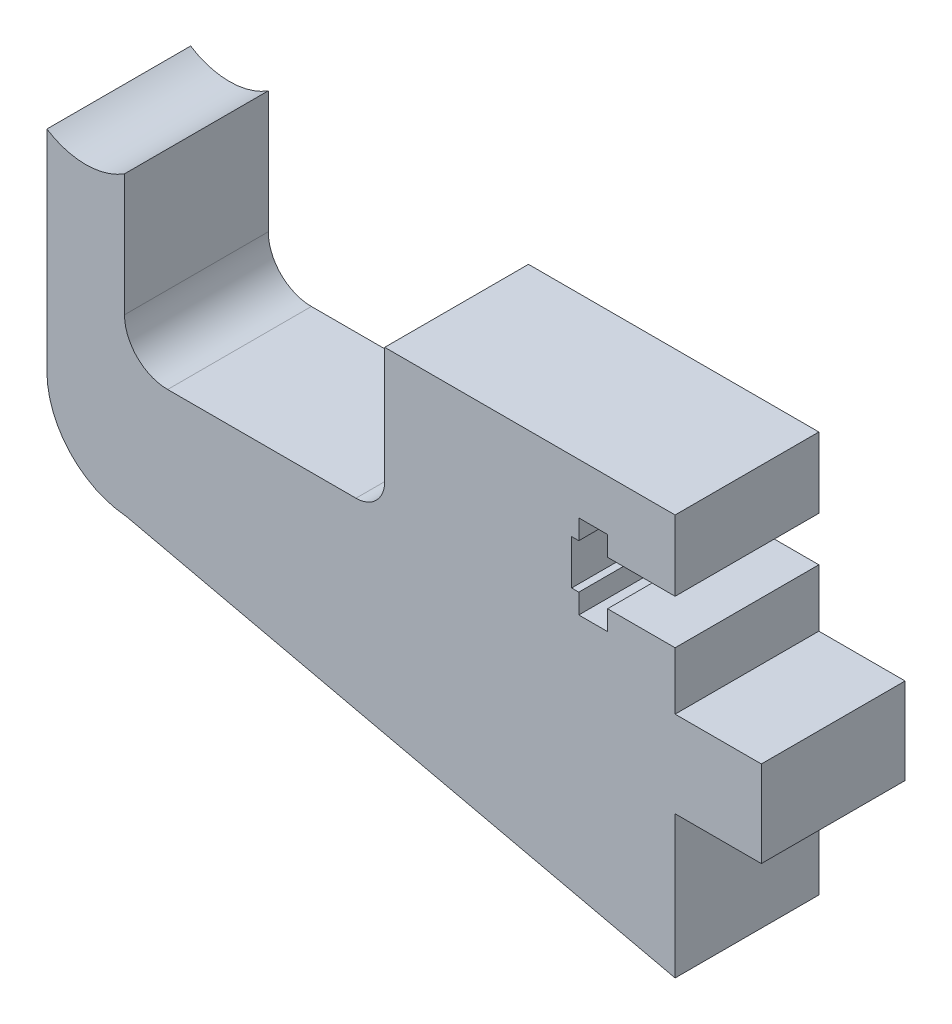
ISO-10303-21;
HEADER;
FILE_DESCRIPTION(('STEP AP214'),'2;1');
FILE_NAME('part.step','',(''),(''),'','','');
FILE_SCHEMA(('AUTOMOTIVE_DESIGN { 1 0 10303 214 1 1 1 1 }'));
ENDSEC;
DATA;
#1=APPLICATION_CONTEXT('core data for automotive mechanical design processes');
#2=APPLICATION_PROTOCOL_DEFINITION('international standard','automotive_design',2000,#1);
#3=PRODUCT_CONTEXT('',#1,'mechanical');
#4=PRODUCT('Part','Part','',(#3));
#5=PRODUCT_RELATED_PRODUCT_CATEGORY('part','',(#4));
#6=PRODUCT_DEFINITION_FORMATION('','',#4);
#7=PRODUCT_DEFINITION_CONTEXT('part definition',#1,'design');
#8=PRODUCT_DEFINITION('design','',#6,#7);
#9=PRODUCT_DEFINITION_SHAPE('','',#8);
#10=(LENGTH_UNIT() NAMED_UNIT(*) SI_UNIT(.MILLI.,.METRE.));
#11=(NAMED_UNIT(*) PLANE_ANGLE_UNIT() SI_UNIT($,.RADIAN.));
#12=(NAMED_UNIT(*) SI_UNIT($,.STERADIAN.) SOLID_ANGLE_UNIT());
#13=UNCERTAINTY_MEASURE_WITH_UNIT(LENGTH_MEASURE(1.E-05),#10,'distance_accuracy_value','');
#14=(GEOMETRIC_REPRESENTATION_CONTEXT(3) GLOBAL_UNCERTAINTY_ASSIGNED_CONTEXT((#13)) GLOBAL_UNIT_ASSIGNED_CONTEXT((#10,
#11,#12)) REPRESENTATION_CONTEXT('',''));
#15=CARTESIAN_POINT('',(0.,0.,0.));
#16=DIRECTION('',(0.,0.,1.));
#17=DIRECTION('',(1.,0.,0.));
#18=AXIS2_PLACEMENT_3D('',#15,#16,#17);
#19=CARTESIAN_POINT('',(-324.852783983054,-479.408833405451,10.));
#20=DIRECTION('',(0.,0.,-1.));
#21=DIRECTION('',(-1.,0.,0.));
#22=AXIS2_PLACEMENT_3D('',#19,#20,#21);
#23=CYLINDRICAL_SURFACE('',#22,3.);
#24=CARTESIAN_POINT('',(-324.852783983054,-479.408833405451,0.));
#25=DIRECTION('',(0.,0.,-1.));
#26=DIRECTION('',(-1.,0.,0.));
#27=AXIS2_PLACEMENT_3D('',#24,#25,#26);
#28=CIRCLE('',#27,3.);
#29=CARTESIAN_POINT('',(-324.852783983054,-482.408833405451,0.));
#30=VERTEX_POINT('',#29);
#31=CARTESIAN_POINT('',(-327.852783983054,-479.408833405451,0.));
#32=VERTEX_POINT('',#31);
#33=EDGE_CURVE('E245',#30,#32,#28,.T.);
#34=ORIENTED_EDGE('',*,*,#33,.T.);
#35=DIRECTION('',(0.,0.,-1.));
#36=VECTOR('',#35,1.);
#37=CARTESIAN_POINT('',(-327.852783983054,-479.408833405451,10.));
#38=LINE('',#37,#36);
#39=CARTESIAN_POINT('',(-327.852783983054,-479.408833405451,10.));
#40=VERTEX_POINT('',#39);
#41=EDGE_CURVE('E11',#40,#32,#38,.T.);
#42=ORIENTED_EDGE('',*,*,#41,.F.);
#43=CARTESIAN_POINT('',(-324.852783983054,-479.408833405451,10.));
#44=DIRECTION('',(0.,0.,-1.));
#45=DIRECTION('',(-1.,0.,0.));
#46=AXIS2_PLACEMENT_3D('',#43,#44,#45);
#47=CIRCLE('',#46,3.);
#48=CARTESIAN_POINT('',(-324.852783983054,-482.408833405451,10.));
#49=VERTEX_POINT('',#48);
#50=EDGE_CURVE('E300',#49,#40,#47,.T.);
#51=ORIENTED_EDGE('',*,*,#50,.F.);
#52=DIRECTION('',(0.,0.,-1.));
#53=VECTOR('',#52,1.);
#54=CARTESIAN_POINT('',(-324.852783983054,-482.408833405451,10.));
#55=LINE('',#54,#53);
#56=EDGE_CURVE('E241',#49,#30,#55,.T.);
#57=ORIENTED_EDGE('',*,*,#56,.T.);
#58=EDGE_LOOP('',(#34,#42,#51,#57));
#59=FACE_BOUND('',#58,.T.);
#60=ADVANCED_FACE('F34',(#59),#23,.F.);
#61=CARTESIAN_POINT('',(-327.852783983054,-473.308184899889,10.));
#62=DIRECTION('',(-1.,0.,0.));
#63=DIRECTION('',(0.,0.,1.));
#64=AXIS2_PLACEMENT_3D('',#61,#62,#63);
#65=PLANE('',#64);
#66=DIRECTION('',(0.,1.,0.));
#67=VECTOR('',#66,1.);
#68=CARTESIAN_POINT('',(-327.852783983054,-473.308184899889,0.));
#69=LINE('',#68,#67);
#70=CARTESIAN_POINT('',(-327.852783983054,-470.917158487951,0.));
#71=VERTEX_POINT('',#70);
#72=EDGE_CURVE('E248',#32,#71,#69,.T.);
#73=ORIENTED_EDGE('',*,*,#72,.T.);
#74=DIRECTION('',(0.,0.,-1.));
#75=VECTOR('',#74,1.);
#76=CARTESIAN_POINT('',(-327.852783983054,-470.917158487951,10.));
#77=LINE('',#76,#75);
#78=CARTESIAN_POINT('',(-327.852783983054,-470.917158487951,10.));
#79=VERTEX_POINT('',#78);
#80=EDGE_CURVE('E42',#79,#71,#77,.T.);
#81=ORIENTED_EDGE('',*,*,#80,.F.);
#82=DIRECTION('',(0.,1.,0.));
#83=VECTOR('',#82,1.);
#84=CARTESIAN_POINT('',(-327.852783983054,-478.408833405451,10.));
#85=LINE('',#84,#83);
#86=EDGE_CURVE('E148',#40,#79,#85,.T.);
#87=ORIENTED_EDGE('',*,*,#86,.F.);
#88=ORIENTED_EDGE('',*,*,#41,.T.);
#89=EDGE_LOOP('',(#73,#81,#87,#88));
#90=FACE_BOUND('',#89,.T.);
#91=ADVANCED_FACE('F442',(#90),#65,.F.);
#92=CARTESIAN_POINT('',(-330.552783983054,-466.708833405451,10.));
#93=DIRECTION('',(0.,0.,-1.));
#94=DIRECTION('',(-1.,0.,0.));
#95=AXIS2_PLACEMENT_3D('',#92,#93,#94);
#96=CYLINDRICAL_SURFACE('',#95,5.00000000000001);
#97=CARTESIAN_POINT('',(-330.552783983054,-466.708833405451,0.));
#98=DIRECTION('',(0.,0.,-1.));
#99=DIRECTION('',(-1.,0.,0.));
#100=AXIS2_PLACEMENT_3D('',#97,#98,#99);
#101=CIRCLE('',#100,5.00000000000001);
#102=CARTESIAN_POINT('',(-333.252783983054,-470.917158487951,0.));
#103=VERTEX_POINT('',#102);
#104=EDGE_CURVE('E250',#71,#103,#101,.T.);
#105=ORIENTED_EDGE('',*,*,#104,.T.);
#106=DIRECTION('',(0.,0.,-1.));
#107=VECTOR('',#106,1.);
#108=CARTESIAN_POINT('',(-333.252783983054,-470.917158487951,10.));
#109=LINE('',#108,#107);
#110=CARTESIAN_POINT('',(-333.252783983054,-470.917158487951,10.));
#111=VERTEX_POINT('',#110);
#112=EDGE_CURVE('E364',#111,#103,#109,.T.);
#113=ORIENTED_EDGE('',*,*,#112,.F.);
#114=CARTESIAN_POINT('',(-330.552783983054,-466.708833405451,10.));
#115=DIRECTION('',(0.,0.,-1.));
#116=DIRECTION('',(-1.,0.,0.));
#117=AXIS2_PLACEMENT_3D('',#114,#115,#116);
#118=CIRCLE('',#117,5.00000000000001);
#119=EDGE_CURVE('E372',#79,#111,#118,.T.);
#120=ORIENTED_EDGE('',*,*,#119,.F.);
#121=ORIENTED_EDGE('',*,*,#80,.T.);
#122=EDGE_LOOP('',(#105,#113,#120,#121));
#123=FACE_BOUND('',#122,.T.);
#124=ADVANCED_FACE('F370',(#123),#96,.F.);
#125=CARTESIAN_POINT('',(-333.252783983054,-470.917158487951,10.));
#126=DIRECTION('',(1.,0.,0.));
#127=DIRECTION('',(0.,0.,-1.));
#128=AXIS2_PLACEMENT_3D('',#125,#126,#127);
#129=PLANE('',#128);
#130=DIRECTION('',(0.,-1.,0.));
#131=VECTOR('',#130,1.);
#132=CARTESIAN_POINT('',(-333.252783983054,-470.917158487951,0.));
#133=LINE('',#132,#131);
#134=CARTESIAN_POINT('',(-333.252783983054,-485.514932983878,0.));
#135=VERTEX_POINT('',#134);
#136=EDGE_CURVE('E252',#103,#135,#133,.T.);
#137=ORIENTED_EDGE('',*,*,#136,.T.);
#138=DIRECTION('',(0.,0.,-1.));
#139=VECTOR('',#138,1.);
#140=CARTESIAN_POINT('',(-333.252783983054,-485.514932983878,10.));
#141=LINE('',#140,#139);
#142=CARTESIAN_POINT('',(-333.252783983054,-485.514932983878,10.));
#143=VERTEX_POINT('',#142);
#144=EDGE_CURVE('E361',#143,#135,#141,.T.);
#145=ORIENTED_EDGE('',*,*,#144,.F.);
#146=DIRECTION('',(0.,-1.,0.));
#147=VECTOR('',#146,1.);
#148=CARTESIAN_POINT('',(-333.252783983054,-470.917158487951,10.));
#149=LINE('',#148,#147);
#150=EDGE_CURVE('E388',#111,#143,#149,.T.);
#151=ORIENTED_EDGE('',*,*,#150,.F.);
#152=ORIENTED_EDGE('',*,*,#112,.T.);
#153=EDGE_LOOP('',(#137,#145,#151,#152));
#154=FACE_BOUND('',#153,.T.);
#155=ADVANCED_FACE('F379',(#154),#129,.F.);
#156=CARTESIAN_POINT('',(-327.252783983054,-485.514932983878,10.));
#157=DIRECTION('',(0.,0.,-1.));
#158=DIRECTION('',(-1.,0.,0.));
#159=AXIS2_PLACEMENT_3D('',#156,#157,#158);
#160=CYLINDRICAL_SURFACE('',#159,6.00000000000001);
#161=CARTESIAN_POINT('',(-327.252783983054,-485.514932983878,0.));
#162=DIRECTION('',(0.,0.,1.));
#163=DIRECTION('',(-1.,0.,0.));
#164=AXIS2_PLACEMENT_3D('',#161,#162,#163);
#165=CIRCLE('',#164,6.00000000000001);
#166=CARTESIAN_POINT('',(-327.723397776628,-491.496448064299,0.));
#167=VERTEX_POINT('',#166);
#168=EDGE_CURVE('E254',#135,#167,#165,.T.);
#169=ORIENTED_EDGE('',*,*,#168,.T.);
#170=DIRECTION('',(0.,0.,-1.));
#171=VECTOR('',#170,1.);
#172=CARTESIAN_POINT('',(-327.723397776628,-491.496448064299,10.));
#173=LINE('',#172,#171);
#174=CARTESIAN_POINT('',(-327.723397776628,-491.496448064299,10.));
#175=VERTEX_POINT('',#174);
#176=EDGE_CURVE('E358',#175,#167,#173,.T.);
#177=ORIENTED_EDGE('',*,*,#176,.F.);
#178=CARTESIAN_POINT('',(-327.252783983054,-485.514932983878,10.));
#179=DIRECTION('',(0.,0.,1.));
#180=DIRECTION('',(-1.,0.,0.));
#181=AXIS2_PLACEMENT_3D('',#178,#179,#180);
#182=CIRCLE('',#181,6.00000000000001);
#183=EDGE_CURVE('E385',#143,#175,#182,.T.);
#184=ORIENTED_EDGE('',*,*,#183,.F.);
#185=ORIENTED_EDGE('',*,*,#144,.T.);
#186=EDGE_LOOP('',(#169,#177,#184,#185));
#187=FACE_BOUND('',#186,.T.);
#188=ADVANCED_FACE('F383',(#187),#160,.T.);
#189=CARTESIAN_POINT('',(-289.552783983054,-500.213295040318,10.));
#190=DIRECTION('',(0.222633899894127,0.974902121557817,0.));
#191=DIRECTION('',(-0.974902121557817,0.222633899894127,0.));
#192=AXIS2_PLACEMENT_3D('',#189,#190,#191);
#193=PLANE('',#192);
#194=DIRECTION('',(0.974902121557817,-0.222633899894127,0.));
#195=VECTOR('',#194,1.);
#196=CARTESIAN_POINT('',(-289.552783983054,-500.213295040318,0.));
#197=LINE('',#196,#195);
#198=CARTESIAN_POINT('',(-289.552783983054,-500.213295040318,0.));
#199=VERTEX_POINT('',#198);
#200=EDGE_CURVE('E256',#167,#199,#197,.T.);
#201=ORIENTED_EDGE('',*,*,#200,.T.);
#202=DIRECTION('',(0.,0.,-1.));
#203=VECTOR('',#202,1.);
#204=CARTESIAN_POINT('',(-289.552783983054,-500.213295040318,10.));
#205=LINE('',#204,#203);
#206=CARTESIAN_POINT('',(-289.552783983054,-500.213295040318,10.));
#207=VERTEX_POINT('',#206);
#208=EDGE_CURVE('E355',#207,#199,#205,.T.);
#209=ORIENTED_EDGE('',*,*,#208,.F.);
#210=DIRECTION('',(0.974902121557817,-0.222633899894127,0.));
#211=VECTOR('',#210,1.);
#212=CARTESIAN_POINT('',(-289.552783983054,-500.213295040318,10.));
#213=LINE('',#212,#211);
#214=EDGE_CURVE('E387',#175,#207,#213,.T.);
#215=ORIENTED_EDGE('',*,*,#214,.F.);
#216=ORIENTED_EDGE('',*,*,#176,.T.);
#217=EDGE_LOOP('',(#201,#209,#215,#216));
#218=FACE_BOUND('',#217,.T.);
#219=ADVANCED_FACE('F454',(#218),#193,.F.);
#220=CARTESIAN_POINT('',(-289.552783983054,-490.318864182122,10.));
#221=DIRECTION('',(-1.,0.,0.));
#222=DIRECTION('',(0.,0.,1.));
#223=AXIS2_PLACEMENT_3D('',#220,#221,#222);
#224=PLANE('',#223);
#225=DIRECTION('',(0.,1.,0.));
#226=VECTOR('',#225,1.);
#227=CARTESIAN_POINT('',(-289.552783983054,-490.318864182122,0.));
#228=LINE('',#227,#226);
#229=CARTESIAN_POINT('',(-289.552783983054,-490.318864182122,0.));
#230=VERTEX_POINT('',#229);
#231=EDGE_CURVE('E259',#199,#230,#228,.T.);
#232=ORIENTED_EDGE('',*,*,#231,.T.);
#233=DIRECTION('',(0.,0.,-1.));
#234=VECTOR('',#233,1.);
#235=CARTESIAN_POINT('',(-289.552783983054,-490.318864182122,10.));
#236=LINE('',#235,#234);
#237=CARTESIAN_POINT('',(-289.552783983054,-490.318864182122,10.));
#238=VERTEX_POINT('',#237);
#239=EDGE_CURVE('E352',#238,#230,#236,.T.);
#240=ORIENTED_EDGE('',*,*,#239,.F.);
#241=DIRECTION('',(0.,1.,0.));
#242=VECTOR('',#241,1.);
#243=CARTESIAN_POINT('',(-289.552783983054,-494.315935468564,10.));
#244=LINE('',#243,#242);
#245=EDGE_CURVE('E390',#207,#238,#244,.T.);
#246=ORIENTED_EDGE('',*,*,#245,.F.);
#247=ORIENTED_EDGE('',*,*,#208,.T.);
#248=EDGE_LOOP('',(#232,#240,#246,#247));
#249=FACE_BOUND('',#248,.T.);
#250=ADVANCED_FACE('F457',(#249),#224,.F.);
#251=CARTESIAN_POINT('',(-283.552783983054,-490.318864182122,10.));
#252=DIRECTION('',(0.,1.,0.));
#253=DIRECTION('',(0.,0.,1.));
#254=AXIS2_PLACEMENT_3D('',#251,#252,#253);
#255=PLANE('',#254);
#256=DIRECTION('',(1.,0.,0.));
#257=VECTOR('',#256,1.);
#258=CARTESIAN_POINT('',(-283.552783983054,-490.318864182122,0.));
#259=LINE('',#258,#257);
#260=CARTESIAN_POINT('',(-283.552783983054,-490.318864182122,0.));
#261=VERTEX_POINT('',#260);
#262=EDGE_CURVE('E261',#230,#261,#259,.T.);
#263=ORIENTED_EDGE('',*,*,#262,.T.);
#264=DIRECTION('',(0.,0.,-1.));
#265=VECTOR('',#264,1.);
#266=CARTESIAN_POINT('',(-283.552783983054,-490.318864182122,10.));
#267=LINE('',#266,#265);
#268=CARTESIAN_POINT('',(-283.552783983054,-490.318864182122,10.));
#269=VERTEX_POINT('',#268);
#270=EDGE_CURVE('E349',#269,#261,#267,.T.);
#271=ORIENTED_EDGE('',*,*,#270,.F.);
#272=DIRECTION('',(1.,0.,0.));
#273=VECTOR('',#272,1.);
#274=CARTESIAN_POINT('',(-283.552783983054,-490.318864182122,10.));
#275=LINE('',#274,#273);
#276=EDGE_CURVE('E396',#238,#269,#275,.T.);
#277=ORIENTED_EDGE('',*,*,#276,.F.);
#278=ORIENTED_EDGE('',*,*,#239,.T.);
#279=EDGE_LOOP('',(#263,#271,#277,#278));
#280=FACE_BOUND('',#279,.T.);
#281=ADVANCED_FACE('F461',(#280),#255,.F.);
#282=CARTESIAN_POINT('',(-283.552783983054,-484.318864182122,10.));
#283=DIRECTION('',(-1.,0.,0.));
#284=DIRECTION('',(0.,0.,1.));
#285=AXIS2_PLACEMENT_3D('',#282,#283,#284);
#286=PLANE('',#285);
#287=DIRECTION('',(0.,1.,0.));
#288=VECTOR('',#287,1.);
#289=CARTESIAN_POINT('',(-283.552783983054,-484.318864182122,0.));
#290=LINE('',#289,#288);
#291=CARTESIAN_POINT('',(-283.552783983054,-484.318864182122,0.));
#292=VERTEX_POINT('',#291);
#293=EDGE_CURVE('E263',#261,#292,#290,.T.);
#294=ORIENTED_EDGE('',*,*,#293,.T.);
#295=DIRECTION('',(0.,0.,-1.));
#296=VECTOR('',#295,1.);
#297=CARTESIAN_POINT('',(-283.552783983054,-484.318864182122,10.));
#298=LINE('',#297,#296);
#299=CARTESIAN_POINT('',(-283.552783983054,-484.318864182122,10.));
#300=VERTEX_POINT('',#299);
#301=EDGE_CURVE('E346',#300,#292,#298,.T.);
#302=ORIENTED_EDGE('',*,*,#301,.F.);
#303=DIRECTION('',(0.,1.,0.));
#304=VECTOR('',#303,1.);
#305=CARTESIAN_POINT('',(-283.552783983054,-484.318864182122,10.));
#306=LINE('',#305,#304);
#307=EDGE_CURVE('E398',#269,#300,#306,.T.);
#308=ORIENTED_EDGE('',*,*,#307,.F.);
#309=ORIENTED_EDGE('',*,*,#270,.T.);
#310=EDGE_LOOP('',(#294,#302,#308,#309));
#311=FACE_BOUND('',#310,.T.);
#312=ADVANCED_FACE('F465',(#311),#286,.F.);
#313=CARTESIAN_POINT('',(-289.552783983054,-484.318864182122,10.));
#314=DIRECTION('',(0.,-1.,0.));
#315=DIRECTION('',(0.,0.,-1.));
#316=AXIS2_PLACEMENT_3D('',#313,#314,#315);
#317=PLANE('',#316);
#318=DIRECTION('',(-1.,0.,0.));
#319=VECTOR('',#318,1.);
#320=CARTESIAN_POINT('',(-289.552783983054,-484.318864182122,0.));
#321=LINE('',#320,#319);
#322=CARTESIAN_POINT('',(-289.552783983054,-484.318864182122,0.));
#323=VERTEX_POINT('',#322);
#324=EDGE_CURVE('E265',#292,#323,#321,.T.);
#325=ORIENTED_EDGE('',*,*,#324,.T.);
#326=DIRECTION('',(0.,0.,-1.));
#327=VECTOR('',#326,1.);
#328=CARTESIAN_POINT('',(-289.552783983054,-484.318864182122,10.));
#329=LINE('',#328,#327);
#330=CARTESIAN_POINT('',(-289.552783983054,-484.318864182122,10.));
#331=VERTEX_POINT('',#330);
#332=EDGE_CURVE('E343',#331,#323,#329,.T.);
#333=ORIENTED_EDGE('',*,*,#332,.F.);
#334=DIRECTION('',(-1.,0.,0.));
#335=VECTOR('',#334,1.);
#336=CARTESIAN_POINT('',(-289.552783983054,-484.318864182122,10.));
#337=LINE('',#336,#335);
#338=EDGE_CURVE('E400',#300,#331,#337,.T.);
#339=ORIENTED_EDGE('',*,*,#338,.F.);
#340=ORIENTED_EDGE('',*,*,#301,.T.);
#341=EDGE_LOOP('',(#325,#333,#339,#340));
#342=FACE_BOUND('',#341,.T.);
#343=ADVANCED_FACE('F469',(#342),#317,.F.);
#344=CARTESIAN_POINT('',(-289.552783983054,-480.318864182122,10.));
#345=DIRECTION('',(-1.,0.,0.));
#346=DIRECTION('',(0.,-1.,0.));
#347=AXIS2_PLACEMENT_3D('',#344,#345,#346);
#348=PLANE('',#347);
#349=DIRECTION('',(0.,1.,0.));
#350=VECTOR('',#349,1.);
#351=CARTESIAN_POINT('',(-289.552783983054,-480.318864182122,0.));
#352=LINE('',#351,#350);
#353=CARTESIAN_POINT('',(-289.552783983054,-480.318864182122,0.));
#354=VERTEX_POINT('',#353);
#355=EDGE_CURVE('E267',#323,#354,#352,.T.);
#356=ORIENTED_EDGE('',*,*,#355,.T.);
#357=DIRECTION('',(0.,0.,-1.));
#358=VECTOR('',#357,1.);
#359=CARTESIAN_POINT('',(-289.552783983054,-480.318864182122,10.));
#360=LINE('',#359,#358);
#361=CARTESIAN_POINT('',(-289.552783983054,-480.318864182122,10.));
#362=VERTEX_POINT('',#361);
#363=EDGE_CURVE('E340',#362,#354,#360,.T.);
#364=ORIENTED_EDGE('',*,*,#363,.F.);
#365=DIRECTION('',(0.,1.,0.));
#366=VECTOR('',#365,1.);
#367=CARTESIAN_POINT('',(-289.552783983054,-480.318864182122,10.));
#368=LINE('',#367,#366);
#369=EDGE_CURVE('E402',#331,#362,#368,.T.);
#370=ORIENTED_EDGE('',*,*,#369,.F.);
#371=ORIENTED_EDGE('',*,*,#332,.T.);
#372=EDGE_LOOP('',(#356,#364,#370,#371));
#373=FACE_BOUND('',#372,.T.);
#374=ADVANCED_FACE('F473',(#373),#348,.F.);
#375=CARTESIAN_POINT('',(-294.252783983054,-480.318864182122,10.));
#376=DIRECTION('',(0.,-1.,0.));
#377=DIRECTION('',(0.,0.,-1.));
#378=AXIS2_PLACEMENT_3D('',#375,#376,#377);
#379=PLANE('',#378);
#380=DIRECTION('',(-1.,0.,0.));
#381=VECTOR('',#380,1.);
#382=CARTESIAN_POINT('',(-294.252783983054,-480.318864182122,0.));
#383=LINE('',#382,#381);
#384=CARTESIAN_POINT('',(-294.252783983054,-480.318864182122,0.));
#385=VERTEX_POINT('',#384);
#386=EDGE_CURVE('E269',#354,#385,#383,.T.);
#387=ORIENTED_EDGE('',*,*,#386,.T.);
#388=DIRECTION('',(0.,0.,-1.));
#389=VECTOR('',#388,1.);
#390=CARTESIAN_POINT('',(-294.252783983054,-480.318864182122,10.));
#391=LINE('',#390,#389);
#392=CARTESIAN_POINT('',(-294.252783983054,-480.318864182122,10.));
#393=VERTEX_POINT('',#392);
#394=EDGE_CURVE('E337',#393,#385,#391,.T.);
#395=ORIENTED_EDGE('',*,*,#394,.F.);
#396=DIRECTION('',(-1.,0.,0.));
#397=VECTOR('',#396,1.);
#398=CARTESIAN_POINT('',(-294.252783983054,-480.318864182122,10.));
#399=LINE('',#398,#397);
#400=EDGE_CURVE('E404',#362,#393,#399,.T.);
#401=ORIENTED_EDGE('',*,*,#400,.F.);
#402=ORIENTED_EDGE('',*,*,#363,.T.);
#403=EDGE_LOOP('',(#387,#395,#401,#402));
#404=FACE_BOUND('',#403,.T.);
#405=ADVANCED_FACE('F477',(#404),#379,.F.);
#406=CARTESIAN_POINT('',(-294.252783983054,-480.318864182122,10.));
#407=DIRECTION('',(1.,0.,0.));
#408=DIRECTION('',(0.,0.,-1.));
#409=AXIS2_PLACEMENT_3D('',#406,#407,#408);
#410=PLANE('',#409);
#411=DIRECTION('',(0.,-1.,0.));
#412=VECTOR('',#411,1.);
#413=CARTESIAN_POINT('',(-294.252783983054,-480.318864182122,0.));
#414=LINE('',#413,#412);
#415=CARTESIAN_POINT('',(-294.252783983054,-481.693864182122,0.));
#416=VERTEX_POINT('',#415);
#417=EDGE_CURVE('E271',#385,#416,#414,.T.);
#418=ORIENTED_EDGE('',*,*,#417,.T.);
#419=DIRECTION('',(0.,0.,-1.));
#420=VECTOR('',#419,1.);
#421=CARTESIAN_POINT('',(-294.252783983054,-481.693864182122,10.));
#422=LINE('',#421,#420);
#423=CARTESIAN_POINT('',(-294.252783983054,-481.693864182122,10.));
#424=VERTEX_POINT('',#423);
#425=EDGE_CURVE('E334',#424,#416,#422,.T.);
#426=ORIENTED_EDGE('',*,*,#425,.F.);
#427=DIRECTION('',(0.,-1.,0.));
#428=VECTOR('',#427,1.);
#429=CARTESIAN_POINT('',(-294.252783983054,-480.318864182122,10.));
#430=LINE('',#429,#428);
#431=EDGE_CURVE('E406',#393,#424,#430,.T.);
#432=ORIENTED_EDGE('',*,*,#431,.F.);
#433=ORIENTED_EDGE('',*,*,#394,.T.);
#434=EDGE_LOOP('',(#418,#426,#432,#433));
#435=FACE_BOUND('',#434,.T.);
#436=ADVANCED_FACE('F481',(#435),#410,.F.);
#437=CARTESIAN_POINT('',(-296.252783983054,-481.693864182122,10.));
#438=DIRECTION('',(0.,-1.,0.));
#439=DIRECTION('',(0.,0.,-1.));
#440=AXIS2_PLACEMENT_3D('',#437,#438,#439);
#441=PLANE('',#440);
#442=DIRECTION('',(-1.,0.,0.));
#443=VECTOR('',#442,1.);
#444=CARTESIAN_POINT('',(-296.252783983054,-481.693864182122,0.));
#445=LINE('',#444,#443);
#446=CARTESIAN_POINT('',(-296.252783983054,-481.693864182122,0.));
#447=VERTEX_POINT('',#446);
#448=EDGE_CURVE('E273',#416,#447,#445,.T.);
#449=ORIENTED_EDGE('',*,*,#448,.T.);
#450=DIRECTION('',(0.,0.,-1.));
#451=VECTOR('',#450,1.);
#452=CARTESIAN_POINT('',(-296.252783983054,-481.693864182122,10.));
#453=LINE('',#452,#451);
#454=CARTESIAN_POINT('',(-296.252783983054,-481.693864182122,10.));
#455=VERTEX_POINT('',#454);
#456=EDGE_CURVE('E331',#455,#447,#453,.T.);
#457=ORIENTED_EDGE('',*,*,#456,.F.);
#458=DIRECTION('',(-1.,0.,0.));
#459=VECTOR('',#458,1.);
#460=CARTESIAN_POINT('',(-296.252783983054,-481.693864182122,10.));
#461=LINE('',#460,#459);
#462=EDGE_CURVE('E408',#424,#455,#461,.T.);
#463=ORIENTED_EDGE('',*,*,#462,.F.);
#464=ORIENTED_EDGE('',*,*,#425,.T.);
#465=EDGE_LOOP('',(#449,#457,#463,#464));
#466=FACE_BOUND('',#465,.T.);
#467=ADVANCED_FACE('F485',(#466),#441,.F.);
#468=CARTESIAN_POINT('',(-296.252783983054,-480.318864182122,10.));
#469=DIRECTION('',(-1.,0.,0.));
#470=DIRECTION('',(0.,0.,1.));
#471=AXIS2_PLACEMENT_3D('',#468,#469,#470);
#472=PLANE('',#471);
#473=DIRECTION('',(0.,1.,0.));
#474=VECTOR('',#473,1.);
#475=CARTESIAN_POINT('',(-296.252783983054,-480.318864182122,0.));
#476=LINE('',#475,#474);
#477=CARTESIAN_POINT('',(-296.252783983054,-480.318864182122,0.));
#478=VERTEX_POINT('',#477);
#479=EDGE_CURVE('E275',#447,#478,#476,.T.);
#480=ORIENTED_EDGE('',*,*,#479,.T.);
#481=DIRECTION('',(0.,0.,-1.));
#482=VECTOR('',#481,1.);
#483=CARTESIAN_POINT('',(-296.252783983054,-480.318864182122,10.));
#484=LINE('',#483,#482);
#485=CARTESIAN_POINT('',(-296.252783983054,-480.318864182122,10.));
#486=VERTEX_POINT('',#485);
#487=EDGE_CURVE('E328',#486,#478,#484,.T.);
#488=ORIENTED_EDGE('',*,*,#487,.F.);
#489=DIRECTION('',(0.,1.,0.));
#490=VECTOR('',#489,1.);
#491=CARTESIAN_POINT('',(-296.252783983054,-480.318864182122,10.));
#492=LINE('',#491,#490);
#493=EDGE_CURVE('E410',#455,#486,#492,.T.);
#494=ORIENTED_EDGE('',*,*,#493,.F.);
#495=ORIENTED_EDGE('',*,*,#456,.T.);
#496=EDGE_LOOP('',(#480,#488,#494,#495));
#497=FACE_BOUND('',#496,.T.);
#498=ADVANCED_FACE('F489',(#497),#472,.F.);
#499=CARTESIAN_POINT('',(-296.252783983054,-480.318864182122,10.));
#500=DIRECTION('',(0.,-1.,0.));
#501=DIRECTION('',(0.,0.,-1.));
#502=AXIS2_PLACEMENT_3D('',#499,#500,#501);
#503=PLANE('',#502);
#504=DIRECTION('',(-1.,0.,0.));
#505=VECTOR('',#504,1.);
#506=CARTESIAN_POINT('',(-296.252783983054,-480.318864182122,0.));
#507=LINE('',#506,#505);
#508=CARTESIAN_POINT('',(-296.752783983054,-480.318864182122,0.));
#509=VERTEX_POINT('',#508);
#510=EDGE_CURVE('E277',#478,#509,#507,.T.);
#511=ORIENTED_EDGE('',*,*,#510,.T.);
#512=DIRECTION('',(0.,0.,-1.));
#513=VECTOR('',#512,1.);
#514=CARTESIAN_POINT('',(-296.752783983054,-480.318864182122,10.));
#515=LINE('',#514,#513);
#516=CARTESIAN_POINT('',(-296.752783983054,-480.318864182122,10.));
#517=VERTEX_POINT('',#516);
#518=EDGE_CURVE('E325',#517,#509,#515,.T.);
#519=ORIENTED_EDGE('',*,*,#518,.F.);
#520=DIRECTION('',(-1.,0.,0.));
#521=VECTOR('',#520,1.);
#522=CARTESIAN_POINT('',(-296.252783983054,-480.318864182122,10.));
#523=LINE('',#522,#521);
#524=EDGE_CURVE('E412',#486,#517,#523,.T.);
#525=ORIENTED_EDGE('',*,*,#524,.F.);
#526=ORIENTED_EDGE('',*,*,#487,.T.);
#527=EDGE_LOOP('',(#511,#519,#525,#526));
#528=FACE_BOUND('',#527,.T.);
#529=ADVANCED_FACE('F493',(#528),#503,.F.);
#530=CARTESIAN_POINT('',(-296.752783983054,-477.218864182122,10.));
#531=DIRECTION('',(-1.,0.,0.));
#532=DIRECTION('',(0.,0.,1.));
#533=AXIS2_PLACEMENT_3D('',#530,#531,#532);
#534=PLANE('',#533);
#535=DIRECTION('',(0.,1.,0.));
#536=VECTOR('',#535,1.);
#537=CARTESIAN_POINT('',(-296.752783983054,-477.218864182122,0.));
#538=LINE('',#537,#536);
#539=CARTESIAN_POINT('',(-296.752783983054,-477.218864182122,0.));
#540=VERTEX_POINT('',#539);
#541=EDGE_CURVE('E279',#509,#540,#538,.T.);
#542=ORIENTED_EDGE('',*,*,#541,.T.);
#543=DIRECTION('',(0.,0.,-1.));
#544=VECTOR('',#543,1.);
#545=CARTESIAN_POINT('',(-296.752783983054,-477.218864182122,10.));
#546=LINE('',#545,#544);
#547=CARTESIAN_POINT('',(-296.752783983054,-477.218864182122,10.));
#548=VERTEX_POINT('',#547);
#549=EDGE_CURVE('E322',#548,#540,#546,.T.);
#550=ORIENTED_EDGE('',*,*,#549,.F.);
#551=DIRECTION('',(0.,1.,0.));
#552=VECTOR('',#551,1.);
#553=CARTESIAN_POINT('',(-296.752783983054,-477.218864182122,10.));
#554=LINE('',#553,#552);
#555=EDGE_CURVE('E414',#517,#548,#554,.T.);
#556=ORIENTED_EDGE('',*,*,#555,.F.);
#557=ORIENTED_EDGE('',*,*,#518,.T.);
#558=EDGE_LOOP('',(#542,#550,#556,#557));
#559=FACE_BOUND('',#558,.T.);
#560=ADVANCED_FACE('F497',(#559),#534,.F.);
#561=CARTESIAN_POINT('',(-296.252783983054,-477.218864182122,10.));
#562=DIRECTION('',(0.,1.,0.));
#563=DIRECTION('',(0.,0.,1.));
#564=AXIS2_PLACEMENT_3D('',#561,#562,#563);
#565=PLANE('',#564);
#566=DIRECTION('',(1.,0.,0.));
#567=VECTOR('',#566,1.);
#568=CARTESIAN_POINT('',(-296.252783983054,-477.218864182122,0.));
#569=LINE('',#568,#567);
#570=CARTESIAN_POINT('',(-296.252783983054,-477.218864182122,0.));
#571=VERTEX_POINT('',#570);
#572=EDGE_CURVE('E281',#540,#571,#569,.T.);
#573=ORIENTED_EDGE('',*,*,#572,.T.);
#574=DIRECTION('',(0.,0.,-1.));
#575=VECTOR('',#574,1.);
#576=CARTESIAN_POINT('',(-296.252783983054,-477.218864182122,10.));
#577=LINE('',#576,#575);
#578=CARTESIAN_POINT('',(-296.252783983054,-477.218864182122,10.));
#579=VERTEX_POINT('',#578);
#580=EDGE_CURVE('E319',#579,#571,#577,.T.);
#581=ORIENTED_EDGE('',*,*,#580,.F.);
#582=DIRECTION('',(1.,0.,0.));
#583=VECTOR('',#582,1.);
#584=CARTESIAN_POINT('',(-296.252783983054,-477.218864182122,10.));
#585=LINE('',#584,#583);
#586=EDGE_CURVE('E416',#548,#579,#585,.T.);
#587=ORIENTED_EDGE('',*,*,#586,.F.);
#588=ORIENTED_EDGE('',*,*,#549,.T.);
#589=EDGE_LOOP('',(#573,#581,#587,#588));
#590=FACE_BOUND('',#589,.T.);
#591=ADVANCED_FACE('F501',(#590),#565,.F.);
#592=CARTESIAN_POINT('',(-296.252783983054,-475.843864182122,10.));
#593=DIRECTION('',(-1.,0.,0.));
#594=DIRECTION('',(0.,0.,1.));
#595=AXIS2_PLACEMENT_3D('',#592,#593,#594);
#596=PLANE('',#595);
#597=DIRECTION('',(0.,1.,0.));
#598=VECTOR('',#597,1.);
#599=CARTESIAN_POINT('',(-296.252783983054,-475.843864182122,0.));
#600=LINE('',#599,#598);
#601=CARTESIAN_POINT('',(-296.252783983054,-475.843864182122,0.));
#602=VERTEX_POINT('',#601);
#603=EDGE_CURVE('E283',#571,#602,#600,.T.);
#604=ORIENTED_EDGE('',*,*,#603,.T.);
#605=DIRECTION('',(0.,0.,-1.));
#606=VECTOR('',#605,1.);
#607=CARTESIAN_POINT('',(-296.252783983054,-475.843864182122,10.));
#608=LINE('',#607,#606);
#609=CARTESIAN_POINT('',(-296.252783983054,-475.843864182122,10.));
#610=VERTEX_POINT('',#609);
#611=EDGE_CURVE('E316',#610,#602,#608,.T.);
#612=ORIENTED_EDGE('',*,*,#611,.F.);
#613=DIRECTION('',(0.,1.,0.));
#614=VECTOR('',#613,1.);
#615=CARTESIAN_POINT('',(-296.252783983054,-475.843864182122,10.));
#616=LINE('',#615,#614);
#617=EDGE_CURVE('E418',#579,#610,#616,.T.);
#618=ORIENTED_EDGE('',*,*,#617,.F.);
#619=ORIENTED_EDGE('',*,*,#580,.T.);
#620=EDGE_LOOP('',(#604,#612,#618,#619));
#621=FACE_BOUND('',#620,.T.);
#622=ADVANCED_FACE('F505',(#621),#596,.F.);
#623=CARTESIAN_POINT('',(-296.252783983054,-475.843864182122,10.));
#624=DIRECTION('',(0.,1.,0.));
#625=DIRECTION('',(0.,0.,1.));
#626=AXIS2_PLACEMENT_3D('',#623,#624,#625);
#627=PLANE('',#626);
#628=DIRECTION('',(1.,0.,0.));
#629=VECTOR('',#628,1.);
#630=CARTESIAN_POINT('',(-296.252783983054,-475.843864182122,0.));
#631=LINE('',#630,#629);
#632=CARTESIAN_POINT('',(-294.252783983054,-475.843864182122,0.));
#633=VERTEX_POINT('',#632);
#634=EDGE_CURVE('E285',#602,#633,#631,.T.);
#635=ORIENTED_EDGE('',*,*,#634,.T.);
#636=DIRECTION('',(0.,0.,-1.));
#637=VECTOR('',#636,1.);
#638=CARTESIAN_POINT('',(-294.252783983054,-475.843864182122,10.));
#639=LINE('',#638,#637);
#640=CARTESIAN_POINT('',(-294.252783983054,-475.843864182122,10.));
#641=VERTEX_POINT('',#640);
#642=EDGE_CURVE('E313',#641,#633,#639,.T.);
#643=ORIENTED_EDGE('',*,*,#642,.F.);
#644=DIRECTION('',(1.,0.,0.));
#645=VECTOR('',#644,1.);
#646=CARTESIAN_POINT('',(-296.252783983054,-475.843864182122,10.));
#647=LINE('',#646,#645);
#648=EDGE_CURVE('E420',#610,#641,#647,.T.);
#649=ORIENTED_EDGE('',*,*,#648,.F.);
#650=ORIENTED_EDGE('',*,*,#611,.T.);
#651=EDGE_LOOP('',(#635,#643,#649,#650));
#652=FACE_BOUND('',#651,.T.);
#653=ADVANCED_FACE('F509',(#652),#627,.F.);
#654=CARTESIAN_POINT('',(-294.252783983054,-475.843864182122,10.));
#655=DIRECTION('',(1.,0.,0.));
#656=DIRECTION('',(0.,0.,-1.));
#657=AXIS2_PLACEMENT_3D('',#654,#655,#656);
#658=PLANE('',#657);
#659=DIRECTION('',(0.,-1.,0.));
#660=VECTOR('',#659,1.);
#661=CARTESIAN_POINT('',(-294.252783983054,-475.843864182122,0.));
#662=LINE('',#661,#660);
#663=CARTESIAN_POINT('',(-294.252783983054,-477.218864182122,0.));
#664=VERTEX_POINT('',#663);
#665=EDGE_CURVE('E287',#633,#664,#662,.T.);
#666=ORIENTED_EDGE('',*,*,#665,.T.);
#667=DIRECTION('',(0.,0.,-1.));
#668=VECTOR('',#667,1.);
#669=CARTESIAN_POINT('',(-294.252783983054,-477.218864182122,10.));
#670=LINE('',#669,#668);
#671=CARTESIAN_POINT('',(-294.252783983054,-477.218864182122,10.));
#672=VERTEX_POINT('',#671);
#673=EDGE_CURVE('E310',#672,#664,#670,.T.);
#674=ORIENTED_EDGE('',*,*,#673,.F.);
#675=DIRECTION('',(0.,-1.,0.));
#676=VECTOR('',#675,1.);
#677=CARTESIAN_POINT('',(-294.252783983054,-475.843864182122,10.));
#678=LINE('',#677,#676);
#679=EDGE_CURVE('E422',#641,#672,#678,.T.);
#680=ORIENTED_EDGE('',*,*,#679,.F.);
#681=ORIENTED_EDGE('',*,*,#642,.T.);
#682=EDGE_LOOP('',(#666,#674,#680,#681));
#683=FACE_BOUND('',#682,.T.);
#684=ADVANCED_FACE('F513',(#683),#658,.F.);
#685=CARTESIAN_POINT('',(-294.252783983054,-477.218864182122,10.));
#686=DIRECTION('',(0.,1.,0.));
#687=DIRECTION('',(0.,0.,1.));
#688=AXIS2_PLACEMENT_3D('',#685,#686,#687);
#689=PLANE('',#688);
#690=DIRECTION('',(1.,0.,0.));
#691=VECTOR('',#690,1.);
#692=CARTESIAN_POINT('',(-294.252783983054,-477.218864182122,0.));
#693=LINE('',#692,#691);
#694=CARTESIAN_POINT('',(-289.552783983054,-477.218864182122,0.));
#695=VERTEX_POINT('',#694);
#696=EDGE_CURVE('E289',#664,#695,#693,.T.);
#697=ORIENTED_EDGE('',*,*,#696,.T.);
#698=DIRECTION('',(0.,0.,-1.));
#699=VECTOR('',#698,1.);
#700=CARTESIAN_POINT('',(-289.552783983054,-477.218864182122,10.));
#701=LINE('',#700,#699);
#702=CARTESIAN_POINT('',(-289.552783983054,-477.218864182122,10.));
#703=VERTEX_POINT('',#702);
#704=EDGE_CURVE('E307',#703,#695,#701,.T.);
#705=ORIENTED_EDGE('',*,*,#704,.F.);
#706=DIRECTION('',(1.,0.,0.));
#707=VECTOR('',#706,1.);
#708=CARTESIAN_POINT('',(-294.252783983054,-477.218864182122,10.));
#709=LINE('',#708,#707);
#710=EDGE_CURVE('E424',#672,#703,#709,.T.);
#711=ORIENTED_EDGE('',*,*,#710,.F.);
#712=ORIENTED_EDGE('',*,*,#673,.T.);
#713=EDGE_LOOP('',(#697,#705,#711,#712));
#714=FACE_BOUND('',#713,.T.);
#715=ADVANCED_FACE('F517',(#714),#689,.F.);
#716=CARTESIAN_POINT('',(-289.552783983054,-477.218864182122,10.));
#717=DIRECTION('',(-1.,0.,0.));
#718=DIRECTION('',(0.,0.,1.));
#719=AXIS2_PLACEMENT_3D('',#716,#717,#718);
#720=PLANE('',#719);
#721=DIRECTION('',(0.,1.,0.));
#722=VECTOR('',#721,1.);
#723=CARTESIAN_POINT('',(-289.552783983054,-477.218864182122,0.));
#724=LINE('',#723,#722);
#725=CARTESIAN_POINT('',(-289.552783983054,-472.318864182122,0.));
#726=VERTEX_POINT('',#725);
#727=EDGE_CURVE('E291',#695,#726,#724,.T.);
#728=ORIENTED_EDGE('',*,*,#727,.T.);
#729=DIRECTION('',(0.,0.,-1.));
#730=VECTOR('',#729,1.);
#731=CARTESIAN_POINT('',(-289.552783983054,-472.318864182122,10.));
#732=LINE('',#731,#730);
#733=CARTESIAN_POINT('',(-289.552783983054,-472.318864182122,10.));
#734=VERTEX_POINT('',#733);
#735=EDGE_CURVE('E304',#734,#726,#732,.T.);
#736=ORIENTED_EDGE('',*,*,#735,.F.);
#737=DIRECTION('',(0.,1.,0.));
#738=VECTOR('',#737,1.);
#739=CARTESIAN_POINT('',(-289.552783983054,-477.218864182122,10.));
#740=LINE('',#739,#738);
#741=EDGE_CURVE('E426',#703,#734,#740,.T.);
#742=ORIENTED_EDGE('',*,*,#741,.F.);
#743=ORIENTED_EDGE('',*,*,#704,.T.);
#744=EDGE_LOOP('',(#728,#736,#742,#743));
#745=FACE_BOUND('',#744,.T.);
#746=ADVANCED_FACE('F432',(#745),#720,.F.);
#747=CARTESIAN_POINT('',(-300.552783983054,-472.318864182122,10.));
#748=DIRECTION('',(0.,-1.,0.));
#749=DIRECTION('',(0.,0.,-1.));
#750=AXIS2_PLACEMENT_3D('',#747,#748,#749);
#751=PLANE('',#750);
#752=DIRECTION('',(-1.,0.,0.));
#753=VECTOR('',#752,1.);
#754=CARTESIAN_POINT('',(-300.552783983054,-472.318864182122,0.));
#755=LINE('',#754,#753);
#756=CARTESIAN_POINT('',(-309.752783983054,-472.318864182122,0.));
#757=VERTEX_POINT('',#756);
#758=EDGE_CURVE('E294',#726,#757,#755,.T.);
#759=ORIENTED_EDGE('',*,*,#758,.T.);
#760=DIRECTION('',(0.,0.,-1.));
#761=VECTOR('',#760,1.);
#762=CARTESIAN_POINT('',(-309.752783983054,-472.318864182122,10.));
#763=LINE('',#762,#761);
#764=CARTESIAN_POINT('',(-309.752783983054,-472.318864182122,10.));
#765=VERTEX_POINT('',#764);
#766=EDGE_CURVE('E236',#765,#757,#763,.T.);
#767=ORIENTED_EDGE('',*,*,#766,.F.);
#768=DIRECTION('',(-1.,0.,0.));
#769=VECTOR('',#768,1.);
#770=CARTESIAN_POINT('',(-300.552783983054,-472.318864182122,10.));
#771=LINE('',#770,#769);
#772=EDGE_CURVE('E225',#734,#765,#771,.T.);
#773=ORIENTED_EDGE('',*,*,#772,.F.);
#774=ORIENTED_EDGE('',*,*,#735,.T.);
#775=EDGE_LOOP('',(#759,#767,#773,#774));
#776=FACE_BOUND('',#775,.T.);
#777=ADVANCED_FACE('F435',(#776),#751,.F.);
#778=CARTESIAN_POINT('',(-309.752783983054,-472.318864182122,10.));
#779=DIRECTION('',(1.,0.,0.));
#780=DIRECTION('',(0.,0.,-1.));
#781=AXIS2_PLACEMENT_3D('',#778,#779,#780);
#782=PLANE('',#781);
#783=DIRECTION('',(0.,-1.,0.));
#784=VECTOR('',#783,1.);
#785=CARTESIAN_POINT('',(-309.752783983054,-472.318864182122,0.));
#786=LINE('',#785,#784);
#787=CARTESIAN_POINT('',(-309.752783983054,-480.408833405451,0.));
#788=VERTEX_POINT('',#787);
#789=EDGE_CURVE('E234',#757,#788,#786,.T.);
#790=ORIENTED_EDGE('',*,*,#789,.T.);
#791=DIRECTION('',(0.,0.,-1.));
#792=VECTOR('',#791,1.);
#793=CARTESIAN_POINT('',(-309.752783983054,-480.408833405451,10.));
#794=LINE('',#793,#792);
#795=CARTESIAN_POINT('',(-309.752783983054,-480.408833405451,10.));
#796=VERTEX_POINT('',#795);
#797=EDGE_CURVE('E231',#796,#788,#794,.T.);
#798=ORIENTED_EDGE('',*,*,#797,.F.);
#799=DIRECTION('',(0.,-1.,0.));
#800=VECTOR('',#799,1.);
#801=CARTESIAN_POINT('',(-309.752783983054,-472.318864182122,10.));
#802=LINE('',#801,#800);
#803=EDGE_CURVE('E218',#765,#796,#802,.T.);
#804=ORIENTED_EDGE('',*,*,#803,.F.);
#805=ORIENTED_EDGE('',*,*,#766,.T.);
#806=EDGE_LOOP('',(#790,#798,#804,#805));
#807=FACE_BOUND('',#806,.T.);
#808=ADVANCED_FACE('F232',(#807),#782,.F.);
#809=CARTESIAN_POINT('',(-311.752783983054,-480.408833405451,10.));
#810=DIRECTION('',(0.,0.,-1.));
#811=DIRECTION('',(-1.,0.,0.));
#812=AXIS2_PLACEMENT_3D('',#809,#810,#811);
#813=CYLINDRICAL_SURFACE('',#812,2.);
#814=CARTESIAN_POINT('',(-311.752783983054,-480.408833405451,0.));
#815=DIRECTION('',(0.,0.,-1.));
#816=DIRECTION('',(1.,0.,0.));
#817=AXIS2_PLACEMENT_3D('',#814,#815,#816);
#818=CIRCLE('',#817,2.);
#819=CARTESIAN_POINT('',(-311.752783983054,-482.408833405451,0.));
#820=VERTEX_POINT('',#819);
#821=EDGE_CURVE('E297',#788,#820,#818,.T.);
#822=ORIENTED_EDGE('',*,*,#821,.T.);
#823=DIRECTION('',(0.,0.,-1.));
#824=VECTOR('',#823,1.);
#825=CARTESIAN_POINT('',(-311.752783983054,-482.408833405451,10.));
#826=LINE('',#825,#824);
#827=CARTESIAN_POINT('',(-311.752783983054,-482.408833405451,10.));
#828=VERTEX_POINT('',#827);
#829=EDGE_CURVE('E237',#828,#820,#826,.T.);
#830=ORIENTED_EDGE('',*,*,#829,.F.);
#831=CARTESIAN_POINT('',(-311.752783983054,-480.408833405451,10.));
#832=DIRECTION('',(0.,0.,-1.));
#833=DIRECTION('',(1.,0.,0.));
#834=AXIS2_PLACEMENT_3D('',#831,#832,#833);
#835=CIRCLE('',#834,2.);
#836=EDGE_CURVE('E222',#796,#828,#835,.T.);
#837=ORIENTED_EDGE('',*,*,#836,.F.);
#838=ORIENTED_EDGE('',*,*,#797,.T.);
#839=EDGE_LOOP('',(#822,#830,#837,#838));
#840=FACE_BOUND('',#839,.T.);
#841=ADVANCED_FACE('F239',(#840),#813,.F.);
#842=CARTESIAN_POINT('',(-320.102783983329,-482.408833405451,10.));
#843=DIRECTION('',(0.,-1.,0.));
#844=DIRECTION('',(0.,0.,-1.));
#845=AXIS2_PLACEMENT_3D('',#842,#843,#844);
#846=PLANE('',#845);
#847=DIRECTION('',(-1.,0.,0.));
#848=VECTOR('',#847,1.);
#849=CARTESIAN_POINT('',(-320.102783983329,-482.408833405451,0.));
#850=LINE('',#849,#848);
#851=EDGE_CURVE('E136',#820,#30,#850,.T.);
#852=ORIENTED_EDGE('',*,*,#851,.T.);
#853=ORIENTED_EDGE('',*,*,#56,.F.);
#854=DIRECTION('',(-1.,0.,0.));
#855=VECTOR('',#854,1.);
#856=CARTESIAN_POINT('',(-320.102783983329,-482.408833405451,10.));
#857=LINE('',#856,#855);
#858=EDGE_CURVE('E50',#828,#49,#857,.T.);
#859=ORIENTED_EDGE('',*,*,#858,.F.);
#860=ORIENTED_EDGE('',*,*,#829,.T.);
#861=EDGE_LOOP('',(#852,#853,#859,#860));
#862=FACE_BOUND('',#861,.T.);
#863=ADVANCED_FACE('F436',(#862),#846,.F.);
#864=CARTESIAN_POINT('',(-324.852783983054,-479.408833405451,10.));
#865=DIRECTION('',(0.,0.,-1.));
#866=DIRECTION('',(-1.,0.,0.));
#867=AXIS2_PLACEMENT_3D('',#864,#865,#866);
#868=PLANE('',#867);
#869=ORIENTED_EDGE('',*,*,#50,.T.);
#870=ORIENTED_EDGE('',*,*,#86,.T.);
#871=ORIENTED_EDGE('',*,*,#119,.T.);
#872=ORIENTED_EDGE('',*,*,#150,.T.);
#873=ORIENTED_EDGE('',*,*,#183,.T.);
#874=ORIENTED_EDGE('',*,*,#214,.T.);
#875=ORIENTED_EDGE('',*,*,#245,.T.);
#876=ORIENTED_EDGE('',*,*,#276,.T.);
#877=ORIENTED_EDGE('',*,*,#307,.T.);
#878=ORIENTED_EDGE('',*,*,#338,.T.);
#879=ORIENTED_EDGE('',*,*,#369,.T.);
#880=ORIENTED_EDGE('',*,*,#400,.T.);
#881=ORIENTED_EDGE('',*,*,#431,.T.);
#882=ORIENTED_EDGE('',*,*,#462,.T.);
#883=ORIENTED_EDGE('',*,*,#493,.T.);
#884=ORIENTED_EDGE('',*,*,#524,.T.);
#885=ORIENTED_EDGE('',*,*,#555,.T.);
#886=ORIENTED_EDGE('',*,*,#586,.T.);
#887=ORIENTED_EDGE('',*,*,#617,.T.);
#888=ORIENTED_EDGE('',*,*,#648,.T.);
#889=ORIENTED_EDGE('',*,*,#679,.T.);
#890=ORIENTED_EDGE('',*,*,#710,.T.);
#891=ORIENTED_EDGE('',*,*,#741,.T.);
#892=ORIENTED_EDGE('',*,*,#772,.T.);
#893=ORIENTED_EDGE('',*,*,#803,.T.);
#894=ORIENTED_EDGE('',*,*,#836,.T.);
#895=ORIENTED_EDGE('',*,*,#858,.T.);
#896=EDGE_LOOP('',(#869,#870,#871,#872,#873,#874,#875,#876,#877,#878,#879,#880,#881,#882,#883,
#884,#885,#886,#887,#888,#889,#890,#891,#892,#893,#894,#895));
#897=FACE_BOUND('',#896,.T.);
#898=ADVANCED_FACE('F220',(#897),#868,.F.);
#899=CARTESIAN_POINT('',(-324.852783983054,-479.408833405451,0.));
#900=DIRECTION('',(0.,0.,-1.));
#901=DIRECTION('',(-1.,0.,0.));
#902=AXIS2_PLACEMENT_3D('',#899,#900,#901);
#903=PLANE('',#902);
#904=ORIENTED_EDGE('',*,*,#33,.F.);
#905=ORIENTED_EDGE('',*,*,#851,.F.);
#906=ORIENTED_EDGE('',*,*,#821,.F.);
#907=ORIENTED_EDGE('',*,*,#789,.F.);
#908=ORIENTED_EDGE('',*,*,#758,.F.);
#909=ORIENTED_EDGE('',*,*,#727,.F.);
#910=ORIENTED_EDGE('',*,*,#696,.F.);
#911=ORIENTED_EDGE('',*,*,#665,.F.);
#912=ORIENTED_EDGE('',*,*,#634,.F.);
#913=ORIENTED_EDGE('',*,*,#603,.F.);
#914=ORIENTED_EDGE('',*,*,#572,.F.);
#915=ORIENTED_EDGE('',*,*,#541,.F.);
#916=ORIENTED_EDGE('',*,*,#510,.F.);
#917=ORIENTED_EDGE('',*,*,#479,.F.);
#918=ORIENTED_EDGE('',*,*,#448,.F.);
#919=ORIENTED_EDGE('',*,*,#417,.F.);
#920=ORIENTED_EDGE('',*,*,#386,.F.);
#921=ORIENTED_EDGE('',*,*,#355,.F.);
#922=ORIENTED_EDGE('',*,*,#324,.F.);
#923=ORIENTED_EDGE('',*,*,#293,.F.);
#924=ORIENTED_EDGE('',*,*,#262,.F.);
#925=ORIENTED_EDGE('',*,*,#231,.F.);
#926=ORIENTED_EDGE('',*,*,#200,.F.);
#927=ORIENTED_EDGE('',*,*,#168,.F.);
#928=ORIENTED_EDGE('',*,*,#136,.F.);
#929=ORIENTED_EDGE('',*,*,#104,.F.);
#930=ORIENTED_EDGE('',*,*,#72,.F.);
#931=EDGE_LOOP('',(#904,#905,#906,#907,#908,#909,#910,#911,#912,#913,#914,#915,#916,#917,#918,
#919,#920,#921,#922,#923,#924,#925,#926,#927,#928,#929,#930));
#932=FACE_BOUND('',#931,.T.);
#933=ADVANCED_FACE('F374',(#932),#903,.T.);
#934=CLOSED_SHELL('',(#60,#91,#124,#155,#188,#219,#250,#281,#312,#343,#374,#405,#436,#467,#498,
#529,#560,#591,#622,#653,#684,#715,#746,#777,#808,#841,#863,#898,#933));
#935=MANIFOLD_SOLID_BREP('B2',#934);
#936=ADVANCED_BREP_SHAPE_REPRESENTATION('',(#18,#935),#14);
#937=SHAPE_DEFINITION_REPRESENTATION(#9,#936);
ENDSEC;
END-ISO-10303-21;
